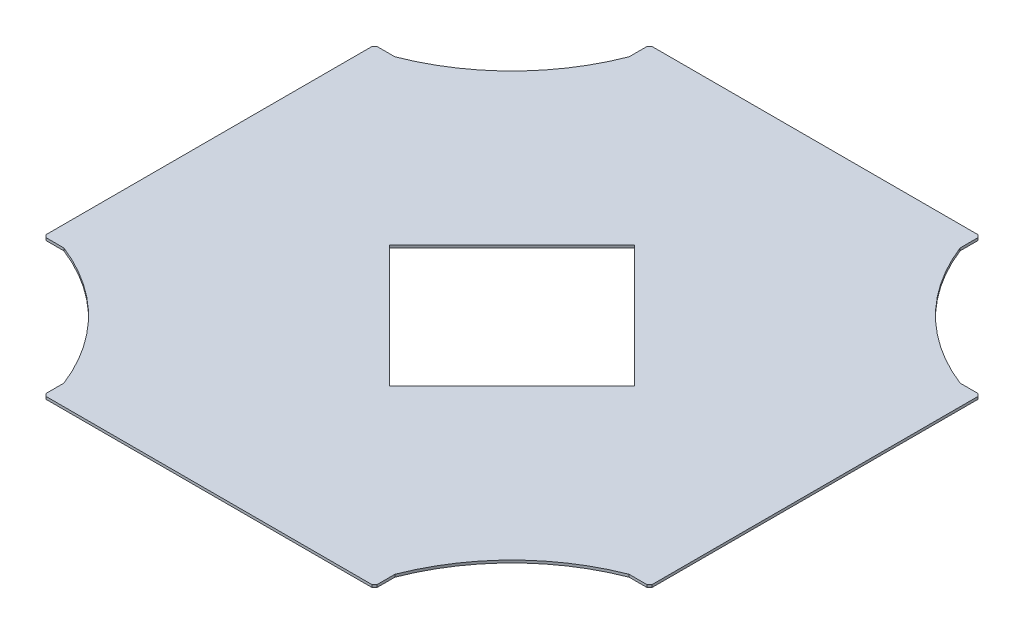
ISO-10303-21;
HEADER;
FILE_DESCRIPTION(('STEP AP214'),'2;1');
FILE_NAME('part.step','',(''),(''),'','','');
FILE_SCHEMA(('AUTOMOTIVE_DESIGN { 1 0 10303 214 1 1 1 1 }'));
ENDSEC;
DATA;
#1=APPLICATION_CONTEXT('core data for automotive mechanical design processes');
#2=APPLICATION_PROTOCOL_DEFINITION('international standard','automotive_design',2000,#1);
#3=PRODUCT_CONTEXT('',#1,'mechanical');
#4=PRODUCT('Part','Part','',(#3));
#5=PRODUCT_RELATED_PRODUCT_CATEGORY('part','',(#4));
#6=PRODUCT_DEFINITION_FORMATION('','',#4);
#7=PRODUCT_DEFINITION_CONTEXT('part definition',#1,'design');
#8=PRODUCT_DEFINITION('design','',#6,#7);
#9=PRODUCT_DEFINITION_SHAPE('','',#8);
#10=(LENGTH_UNIT() NAMED_UNIT(*) SI_UNIT(.MILLI.,.METRE.));
#11=(NAMED_UNIT(*) PLANE_ANGLE_UNIT() SI_UNIT($,.RADIAN.));
#12=(NAMED_UNIT(*) SI_UNIT($,.STERADIAN.) SOLID_ANGLE_UNIT());
#13=UNCERTAINTY_MEASURE_WITH_UNIT(LENGTH_MEASURE(1.E-05),#10,'distance_accuracy_value','');
#14=(GEOMETRIC_REPRESENTATION_CONTEXT(3) GLOBAL_UNCERTAINTY_ASSIGNED_CONTEXT((#13)) GLOBAL_UNIT_ASSIGNED_CONTEXT((#10,
#11,#12)) REPRESENTATION_CONTEXT('',''));
#15=CARTESIAN_POINT('',(0.,0.,0.));
#16=DIRECTION('',(0.,0.,1.));
#17=DIRECTION('',(1.,0.,0.));
#18=AXIS2_PLACEMENT_3D('',#15,#16,#17);
#19=CARTESIAN_POINT('',(377.825,-3.175,377.825));
#20=DIRECTION('',(1.,0.,0.));
#21=DIRECTION('',(0.,0.,-1.));
#22=AXIS2_PLACEMENT_3D('',#19,#20,#21);
#23=PLANE('',#22);
#24=DIRECTION('',(0.,0.,-1.));
#25=VECTOR('',#24,1.);
#26=CARTESIAN_POINT('',(377.825,-3.175,377.825));
#27=LINE('',#26,#25);
#28=CARTESIAN_POINT('',(377.825,-3.175,203.200000000004));
#29=VERTEX_POINT('',#28);
#30=CARTESIAN_POINT('',(377.825,-3.175,-203.2));
#31=VERTEX_POINT('',#30);
#32=EDGE_CURVE('E362',#29,#31,#27,.T.);
#33=ORIENTED_EDGE('',*,*,#32,.T.);
#34=DIRECTION('',(0.,1.,0.));
#35=VECTOR('',#34,1.);
#36=CARTESIAN_POINT('',(377.825,0.,-203.2));
#37=LINE('',#36,#35);
#38=CARTESIAN_POINT('',(377.825,0.,-203.2));
#39=VERTEX_POINT('',#38);
#40=EDGE_CURVE('E445',#31,#39,#37,.T.);
#41=ORIENTED_EDGE('',*,*,#40,.T.);
#42=DIRECTION('',(0.,0.,-1.));
#43=VECTOR('',#42,1.);
#44=CARTESIAN_POINT('',(377.825,0.,377.825));
#45=LINE('',#44,#43);
#46=CARTESIAN_POINT('',(377.825,0.,203.200000000004));
#47=VERTEX_POINT('',#46);
#48=EDGE_CURVE('E355',#47,#39,#45,.T.);
#49=ORIENTED_EDGE('',*,*,#48,.F.);
#50=DIRECTION('',(0.,-1.,0.));
#51=VECTOR('',#50,1.);
#52=CARTESIAN_POINT('',(377.825,-3.175,203.200000000004));
#53=LINE('',#52,#51);
#54=EDGE_CURVE('E441',#47,#29,#53,.T.);
#55=ORIENTED_EDGE('',*,*,#54,.T.);
#56=EDGE_LOOP('',(#33,#41,#49,#55));
#57=FACE_BOUND('',#56,.T.);
#58=ADVANCED_FACE('F49',(#57),#23,.T.);
#59=CARTESIAN_POINT('',(-377.825,-3.175,377.825));
#60=DIRECTION('',(0.,0.,1.));
#61=DIRECTION('',(1.,0.,0.));
#62=AXIS2_PLACEMENT_3D('',#59,#60,#61);
#63=PLANE('',#62);
#64=DIRECTION('',(1.,0.,0.));
#65=VECTOR('',#64,1.);
#66=CARTESIAN_POINT('',(-377.825,-3.175,377.825));
#67=LINE('',#66,#65);
#68=CARTESIAN_POINT('',(-203.199999999988,-3.175,377.825));
#69=VERTEX_POINT('',#68);
#70=CARTESIAN_POINT('',(203.200000000016,-3.175,377.825));
#71=VERTEX_POINT('',#70);
#72=EDGE_CURVE('E372',#69,#71,#67,.T.);
#73=ORIENTED_EDGE('',*,*,#72,.T.);
#74=DIRECTION('',(0.,1.,0.));
#75=VECTOR('',#74,1.);
#76=CARTESIAN_POINT('',(203.200000000016,0.,377.825));
#77=LINE('',#76,#75);
#78=CARTESIAN_POINT('',(203.200000000016,0.,377.825));
#79=VERTEX_POINT('',#78);
#80=EDGE_CURVE('E428',#71,#79,#77,.T.);
#81=ORIENTED_EDGE('',*,*,#80,.T.);
#82=DIRECTION('',(1.,0.,0.));
#83=VECTOR('',#82,1.);
#84=CARTESIAN_POINT('',(-377.825,0.,377.825));
#85=LINE('',#84,#83);
#86=CARTESIAN_POINT('',(-203.199999999988,0.,377.825));
#87=VERTEX_POINT('',#86);
#88=EDGE_CURVE('E366',#87,#79,#85,.T.);
#89=ORIENTED_EDGE('',*,*,#88,.F.);
#90=DIRECTION('',(0.,-1.,0.));
#91=VECTOR('',#90,1.);
#92=CARTESIAN_POINT('',(-203.199999999988,-3.175,377.825));
#93=LINE('',#92,#91);
#94=EDGE_CURVE('E424',#87,#69,#93,.T.);
#95=ORIENTED_EDGE('',*,*,#94,.T.);
#96=EDGE_LOOP('',(#73,#81,#89,#95));
#97=FACE_BOUND('',#96,.T.);
#98=ADVANCED_FACE('F471',(#97),#63,.T.);
#99=CARTESIAN_POINT('',(-377.825,-3.175,377.825));
#100=DIRECTION('',(-1.,0.,0.));
#101=DIRECTION('',(0.,0.,1.));
#102=AXIS2_PLACEMENT_3D('',#99,#100,#101);
#103=PLANE('',#102);
#104=DIRECTION('',(0.,0.,1.));
#105=VECTOR('',#104,1.);
#106=CARTESIAN_POINT('',(-377.825,-3.175,377.825));
#107=LINE('',#106,#105);
#108=CARTESIAN_POINT('',(-377.825,-3.175,-203.199999999984));
#109=VERTEX_POINT('',#108);
#110=CARTESIAN_POINT('',(-377.825,-3.175,203.20000000002));
#111=VERTEX_POINT('',#110);
#112=EDGE_CURVE('E369',#109,#111,#107,.T.);
#113=ORIENTED_EDGE('',*,*,#112,.T.);
#114=DIRECTION('',(0.,1.,0.));
#115=VECTOR('',#114,1.);
#116=CARTESIAN_POINT('',(-377.825,0.,203.20000000002));
#117=LINE('',#116,#115);
#118=CARTESIAN_POINT('',(-377.825,0.,203.20000000002));
#119=VERTEX_POINT('',#118);
#120=EDGE_CURVE('E410',#111,#119,#117,.T.);
#121=ORIENTED_EDGE('',*,*,#120,.T.);
#122=DIRECTION('',(0.,0.,1.));
#123=VECTOR('',#122,1.);
#124=CARTESIAN_POINT('',(-377.825,0.,377.825));
#125=LINE('',#124,#123);
#126=CARTESIAN_POINT('',(-377.825,0.,-203.199999999984));
#127=VERTEX_POINT('',#126);
#128=EDGE_CURVE('E380',#127,#119,#125,.T.);
#129=ORIENTED_EDGE('',*,*,#128,.F.);
#130=DIRECTION('',(0.,-1.,0.));
#131=VECTOR('',#130,1.);
#132=CARTESIAN_POINT('',(-377.825,-3.175,-203.199999999984));
#133=LINE('',#132,#131);
#134=EDGE_CURVE('E406',#127,#109,#133,.T.);
#135=ORIENTED_EDGE('',*,*,#134,.T.);
#136=EDGE_LOOP('',(#113,#121,#129,#135));
#137=FACE_BOUND('',#136,.T.);
#138=ADVANCED_FACE('F477',(#137),#103,.T.);
#139=CARTESIAN_POINT('',(-377.825,-3.175,-377.825));
#140=DIRECTION('',(0.,0.,-1.));
#141=DIRECTION('',(-1.,0.,0.));
#142=AXIS2_PLACEMENT_3D('',#139,#140,#141);
#143=PLANE('',#142);
#144=DIRECTION('',(-1.,0.,0.));
#145=VECTOR('',#144,1.);
#146=CARTESIAN_POINT('',(-377.825,-3.175,-377.825));
#147=LINE('',#146,#145);
#148=CARTESIAN_POINT('',(203.2,-3.175,-377.825));
#149=VERTEX_POINT('',#148);
#150=CARTESIAN_POINT('',(-203.200000000004,-3.175,-377.825));
#151=VERTEX_POINT('',#150);
#152=EDGE_CURVE('E365',#149,#151,#147,.T.);
#153=ORIENTED_EDGE('',*,*,#152,.T.);
#154=DIRECTION('',(0.,1.,0.));
#155=VECTOR('',#154,1.);
#156=CARTESIAN_POINT('',(-203.200000000004,0.,-377.825));
#157=LINE('',#156,#155);
#158=CARTESIAN_POINT('',(-203.200000000004,0.,-377.825));
#159=VERTEX_POINT('',#158);
#160=EDGE_CURVE('E392',#151,#159,#157,.T.);
#161=ORIENTED_EDGE('',*,*,#160,.T.);
#162=DIRECTION('',(-1.,0.,0.));
#163=VECTOR('',#162,1.);
#164=CARTESIAN_POINT('',(-377.825,0.,-377.825));
#165=LINE('',#164,#163);
#166=CARTESIAN_POINT('',(203.2,0.,-377.825));
#167=VERTEX_POINT('',#166);
#168=EDGE_CURVE('E377',#167,#159,#165,.T.);
#169=ORIENTED_EDGE('',*,*,#168,.F.);
#170=DIRECTION('',(0.,-1.,0.));
#171=VECTOR('',#170,1.);
#172=CARTESIAN_POINT('',(203.2,-3.175,-377.825));
#173=LINE('',#172,#171);
#174=EDGE_CURVE('E388',#167,#149,#173,.T.);
#175=ORIENTED_EDGE('',*,*,#174,.T.);
#176=EDGE_LOOP('',(#153,#161,#169,#175));
#177=FACE_BOUND('',#176,.T.);
#178=ADVANCED_FACE('F482',(#177),#143,.T.);
#179=CARTESIAN_POINT('',(0.,-3.175,0.));
#180=DIRECTION('',(0.,-1.,0.));
#181=DIRECTION('',(0.,0.,-1.));
#182=AXIS2_PLACEMENT_3D('',#179,#180,#181);
#183=PLANE('',#182);
#184=DIRECTION('',(1.,0.,0.));
#185=VECTOR('',#184,1.);
#186=CARTESIAN_POINT('',(377.825,-3.175,-206.375));
#187=LINE('',#186,#185);
#188=CARTESIAN_POINT('',(352.425,-3.175,-206.375));
#189=VERTEX_POINT('',#188);
#190=CARTESIAN_POINT('',(374.65,-3.175,-206.375));
#191=VERTEX_POINT('',#190);
#192=EDGE_CURVE('E317',#189,#191,#187,.T.);
#193=ORIENTED_EDGE('',*,*,#192,.T.);
#194=DIRECTION('',(0.707106781186548,0.,0.707106781186548));
#195=VECTOR('',#194,1.);
#196=CARTESIAN_POINT('',(290.5125,-3.175,-290.5125));
#197=LINE('',#196,#195);
#198=EDGE_CURVE('E11',#191,#31,#197,.T.);
#199=ORIENTED_EDGE('',*,*,#198,.T.);
#200=ORIENTED_EDGE('',*,*,#32,.F.);
#201=DIRECTION('',(-0.707106781186551,0.,0.707106781186544));
#202=VECTOR('',#201,1.);
#203=CARTESIAN_POINT('',(290.5125,-3.175,290.512500000003));
#204=LINE('',#203,#202);
#205=CARTESIAN_POINT('',(374.65,-3.175,206.375000000004));
#206=VERTEX_POINT('',#205);
#207=EDGE_CURVE('E443',#29,#206,#204,.T.);
#208=ORIENTED_EDGE('',*,*,#207,.T.);
#209=DIRECTION('',(-1.,0.,0.));
#210=VECTOR('',#209,1.);
#211=CARTESIAN_POINT('',(352.425000000016,-3.175,206.375000000004));
#212=LINE('',#211,#210);
#213=CARTESIAN_POINT('',(352.425000000016,-3.175,206.375000000004));
#214=VERTEX_POINT('',#213);
#215=EDGE_CURVE('E260',#206,#214,#212,.T.);
#216=ORIENTED_EDGE('',*,*,#215,.T.);
#217=CARTESIAN_POINT('',(444.763645459311,-3.175,444.763645459299));
#218=DIRECTION('',(0.,1.,0.));
#219=DIRECTION('',(0.,0.,-1.));
#220=AXIS2_PLACEMENT_3D('',#217,#218,#219);
#221=CIRCLE('',#220,255.647358150196);
#222=CARTESIAN_POINT('',(206.375000000016,-3.175,352.425000000004));
#223=VERTEX_POINT('',#222);
#224=EDGE_CURVE('E262',#214,#223,#221,.T.);
#225=ORIENTED_EDGE('',*,*,#224,.T.);
#226=DIRECTION('',(0.,0.,1.));
#227=VECTOR('',#226,1.);
#228=CARTESIAN_POINT('',(206.375000000016,-3.175,377.825000000004));
#229=LINE('',#228,#227);
#230=CARTESIAN_POINT('',(206.375000000016,-3.175,374.65));
#231=VERTEX_POINT('',#230);
#232=EDGE_CURVE('E242',#223,#231,#229,.T.);
#233=ORIENTED_EDGE('',*,*,#232,.T.);
#234=DIRECTION('',(-0.707106781186544,0.,0.707106781186551));
#235=VECTOR('',#234,1.);
#236=CARTESIAN_POINT('',(290.512500000009,-3.175,290.512500000006));
#237=LINE('',#236,#235);
#238=EDGE_CURVE('E434',#231,#71,#237,.T.);
#239=ORIENTED_EDGE('',*,*,#238,.T.);
#240=ORIENTED_EDGE('',*,*,#72,.F.);
#241=DIRECTION('',(-0.707106781186544,0.,-0.707106781186551));
#242=VECTOR('',#241,1.);
#243=CARTESIAN_POINT('',(-290.512499999995,-3.175,290.512499999992));
#244=LINE('',#243,#242);
#245=CARTESIAN_POINT('',(-206.374999999988,-3.175,374.65));
#246=VERTEX_POINT('',#245);
#247=EDGE_CURVE('E426',#69,#246,#244,.T.);
#248=ORIENTED_EDGE('',*,*,#247,.T.);
#249=DIRECTION('',(0.,0.,-1.));
#250=VECTOR('',#249,1.);
#251=CARTESIAN_POINT('',(-206.374999999988,-3.175,352.42500000002));
#252=LINE('',#251,#250);
#253=CARTESIAN_POINT('',(-206.374999999988,-3.175,352.42500000002));
#254=VERTEX_POINT('',#253);
#255=EDGE_CURVE('E281',#246,#254,#252,.T.);
#256=ORIENTED_EDGE('',*,*,#255,.T.);
#257=CARTESIAN_POINT('',(-444.763645459283,-3.175,444.763645459315));
#258=DIRECTION('',(0.,1.,0.));
#259=DIRECTION('',(0.,0.,-1.));
#260=AXIS2_PLACEMENT_3D('',#257,#258,#259);
#261=CIRCLE('',#260,255.647358150196);
#262=CARTESIAN_POINT('',(-352.424999999988,-3.175,206.37500000002));
#263=VERTEX_POINT('',#262);
#264=EDGE_CURVE('E287',#254,#263,#261,.T.);
#265=ORIENTED_EDGE('',*,*,#264,.T.);
#266=DIRECTION('',(-1.,0.,0.));
#267=VECTOR('',#266,1.);
#268=CARTESIAN_POINT('',(-377.824999999988,-3.175,206.37500000002));
#269=LINE('',#268,#267);
#270=CARTESIAN_POINT('',(-374.65,-3.175,206.37500000002));
#271=VERTEX_POINT('',#270);
#272=EDGE_CURVE('E273',#263,#271,#269,.T.);
#273=ORIENTED_EDGE('',*,*,#272,.T.);
#274=DIRECTION('',(-0.707106781186551,0.,-0.707106781186544));
#275=VECTOR('',#274,1.);
#276=CARTESIAN_POINT('',(-290.512500000008,-3.175,290.512500000011));
#277=LINE('',#276,#275);
#278=EDGE_CURVE('E417',#271,#111,#277,.T.);
#279=ORIENTED_EDGE('',*,*,#278,.T.);
#280=ORIENTED_EDGE('',*,*,#112,.F.);
#281=DIRECTION('',(0.707106781186544,0.,-0.707106781186551));
#282=VECTOR('',#281,1.);
#283=CARTESIAN_POINT('',(-290.512499999994,-3.175,-290.512499999991));
#284=LINE('',#283,#282);
#285=CARTESIAN_POINT('',(-374.65,-3.175,-206.374999999984));
#286=VERTEX_POINT('',#285);
#287=EDGE_CURVE('E408',#109,#286,#284,.T.);
#288=ORIENTED_EDGE('',*,*,#287,.T.);
#289=DIRECTION('',(1.,0.,0.));
#290=VECTOR('',#289,1.);
#291=CARTESIAN_POINT('',(-352.425000000004,-3.175,-206.374999999984));
#292=LINE('',#291,#290);
#293=CARTESIAN_POINT('',(-352.425000000004,-3.175,-206.374999999984));
#294=VERTEX_POINT('',#293);
#295=EDGE_CURVE('E301',#286,#294,#292,.T.);
#296=ORIENTED_EDGE('',*,*,#295,.T.);
#297=CARTESIAN_POINT('',(-444.763645459299,-3.175,-444.763645459279));
#298=DIRECTION('',(0.,1.,0.));
#299=DIRECTION('',(0.,0.,-1.));
#300=AXIS2_PLACEMENT_3D('',#297,#298,#299);
#301=CIRCLE('',#300,255.647358150196);
#302=CARTESIAN_POINT('',(-206.375000000004,-3.175,-352.424999999984));
#303=VERTEX_POINT('',#302);
#304=EDGE_CURVE('E307',#294,#303,#301,.T.);
#305=ORIENTED_EDGE('',*,*,#304,.T.);
#306=DIRECTION('',(0.,0.,-1.));
#307=VECTOR('',#306,1.);
#308=CARTESIAN_POINT('',(-206.375000000004,-3.175,-377.824999999984));
#309=LINE('',#308,#307);
#310=CARTESIAN_POINT('',(-206.375000000004,-3.175,-374.65));
#311=VERTEX_POINT('',#310);
#312=EDGE_CURVE('E294',#303,#311,#309,.T.);
#313=ORIENTED_EDGE('',*,*,#312,.T.);
#314=DIRECTION('',(0.707106781186544,0.,-0.707106781186551));
#315=VECTOR('',#314,1.);
#316=CARTESIAN_POINT('',(-290.512500000003,-3.175,-290.5125));
#317=LINE('',#316,#315);
#318=EDGE_CURVE('E399',#311,#151,#317,.T.);
#319=ORIENTED_EDGE('',*,*,#318,.T.);
#320=ORIENTED_EDGE('',*,*,#152,.F.);
#321=DIRECTION('',(0.707106781186541,0.,0.707106781186554));
#322=VECTOR('',#321,1.);
#323=CARTESIAN_POINT('',(290.512500000002,-3.175,-290.512499999997));
#324=LINE('',#323,#322);
#325=CARTESIAN_POINT('',(206.375,-3.175,-374.65));
#326=VERTEX_POINT('',#325);
#327=EDGE_CURVE('E390',#149,#326,#324,.T.);
#328=ORIENTED_EDGE('',*,*,#327,.T.);
#329=DIRECTION('',(0.,0.,1.));
#330=VECTOR('',#329,1.);
#331=CARTESIAN_POINT('',(206.375,-3.175,-352.425));
#332=LINE('',#331,#330);
#333=CARTESIAN_POINT('',(206.375,-3.175,-352.425));
#334=VERTEX_POINT('',#333);
#335=EDGE_CURVE('E311',#326,#334,#332,.T.);
#336=ORIENTED_EDGE('',*,*,#335,.T.);
#337=CARTESIAN_POINT('',(444.763645459295,-3.175,-444.763645459295));
#338=DIRECTION('',(0.,1.,0.));
#339=DIRECTION('',(0.,0.,-1.));
#340=AXIS2_PLACEMENT_3D('',#337,#338,#339);
#341=CIRCLE('',#340,255.647358150196);
#342=EDGE_CURVE('E313',#334,#189,#341,.T.);
#343=ORIENTED_EDGE('',*,*,#342,.T.);
#344=EDGE_LOOP('',(#193,#199,#200,#208,#216,#225,#233,#239,#240,#248,#256,#265,#273,#279,#280,
#288,#296,#305,#313,#319,#320,#328,#336,#343));
#345=FACE_BOUND('',#344,.T.);
#346=DIRECTION('',(0.707106781186548,0.,0.707106781186547));
#347=VECTOR('',#346,1.);
#348=CARTESIAN_POINT('',(0.,-3.175,152.664354058176));
#349=LINE('',#348,#347);
#350=CARTESIAN_POINT('',(-152.664354058176,-3.175,0.));
#351=VERTEX_POINT('',#350);
#352=CARTESIAN_POINT('',(0.,-3.175,152.664354058176));
#353=VERTEX_POINT('',#352);
#354=EDGE_CURVE('E330',#351,#353,#349,.T.);
#355=ORIENTED_EDGE('',*,*,#354,.T.);
#356=DIRECTION('',(0.707106781186547,0.,-0.707106781186547));
#357=VECTOR('',#356,1.);
#358=CARTESIAN_POINT('',(0.,-3.175,152.664354058176));
#359=LINE('',#358,#357);
#360=CARTESIAN_POINT('',(152.664354058176,-3.175,0.));
#361=VERTEX_POINT('',#360);
#362=EDGE_CURVE('E333',#353,#361,#359,.T.);
#363=ORIENTED_EDGE('',*,*,#362,.T.);
#364=DIRECTION('',(-0.707106781186548,0.,-0.707106781186547));
#365=VECTOR('',#364,1.);
#366=CARTESIAN_POINT('',(152.664354058176,-3.175,0.));
#367=LINE('',#366,#365);
#368=CARTESIAN_POINT('',(0.,-3.175,-152.664354058176));
#369=VERTEX_POINT('',#368);
#370=EDGE_CURVE('E337',#361,#369,#367,.T.);
#371=ORIENTED_EDGE('',*,*,#370,.T.);
#372=DIRECTION('',(-0.707106781186547,0.,0.707106781186548));
#373=VECTOR('',#372,1.);
#374=CARTESIAN_POINT('',(-152.664354058176,-3.175,0.));
#375=LINE('',#374,#373);
#376=EDGE_CURVE('E340',#369,#351,#375,.T.);
#377=ORIENTED_EDGE('',*,*,#376,.T.);
#378=EDGE_LOOP('',(#355,#363,#371,#377));
#379=FACE_BOUND('',#378,.T.);
#380=ADVANCED_FACE('F463',(#345,#379),#183,.T.);
#381=CARTESIAN_POINT('',(0.,0.,0.));
#382=DIRECTION('',(0.,-1.,0.));
#383=DIRECTION('',(0.,0.,-1.));
#384=AXIS2_PLACEMENT_3D('',#381,#382,#383);
#385=PLANE('',#384);
#386=DIRECTION('',(0.707106781186547,0.,-0.707106781186547));
#387=VECTOR('',#386,1.);
#388=CARTESIAN_POINT('',(0.,0.,152.664354058176));
#389=LINE('',#388,#387);
#390=CARTESIAN_POINT('',(0.,0.,152.664354058176));
#391=VERTEX_POINT('',#390);
#392=CARTESIAN_POINT('',(152.664354058176,0.,0.));
#393=VERTEX_POINT('',#392);
#394=EDGE_CURVE('E345',#391,#393,#389,.T.);
#395=ORIENTED_EDGE('',*,*,#394,.F.);
#396=DIRECTION('',(0.707106781186548,0.,0.707106781186547));
#397=VECTOR('',#396,1.);
#398=CARTESIAN_POINT('',(0.,0.,152.664354058176));
#399=LINE('',#398,#397);
#400=CARTESIAN_POINT('',(-152.664354058176,0.,0.));
#401=VERTEX_POINT('',#400);
#402=EDGE_CURVE('E327',#401,#391,#399,.T.);
#403=ORIENTED_EDGE('',*,*,#402,.F.);
#404=DIRECTION('',(-0.707106781186547,0.,0.707106781186548));
#405=VECTOR('',#404,1.);
#406=CARTESIAN_POINT('',(-152.664354058176,0.,0.));
#407=LINE('',#406,#405);
#408=CARTESIAN_POINT('',(0.,0.,-152.664354058176));
#409=VERTEX_POINT('',#408);
#410=EDGE_CURVE('E334',#409,#401,#407,.T.);
#411=ORIENTED_EDGE('',*,*,#410,.F.);
#412=DIRECTION('',(-0.707106781186548,0.,-0.707106781186547));
#413=VECTOR('',#412,1.);
#414=CARTESIAN_POINT('',(152.664354058176,0.,0.));
#415=LINE('',#414,#413);
#416=EDGE_CURVE('E348',#393,#409,#415,.T.);
#417=ORIENTED_EDGE('',*,*,#416,.F.);
#418=EDGE_LOOP('',(#395,#403,#411,#417));
#419=FACE_BOUND('',#418,.T.);
#420=ORIENTED_EDGE('',*,*,#48,.T.);
#421=DIRECTION('',(-0.707106781186548,0.,-0.707106781186548));
#422=VECTOR('',#421,1.);
#423=CARTESIAN_POINT('',(377.825,0.,-203.2));
#424=LINE('',#423,#422);
#425=CARTESIAN_POINT('',(374.65,0.,-206.375));
#426=VERTEX_POINT('',#425);
#427=EDGE_CURVE('E72',#39,#426,#424,.T.);
#428=ORIENTED_EDGE('',*,*,#427,.T.);
#429=DIRECTION('',(1.,0.,0.));
#430=VECTOR('',#429,1.);
#431=CARTESIAN_POINT('',(377.825,0.,-206.375));
#432=LINE('',#431,#430);
#433=CARTESIAN_POINT('',(352.425,0.,-206.375));
#434=VERTEX_POINT('',#433);
#435=EDGE_CURVE('E314',#434,#426,#432,.T.);
#436=ORIENTED_EDGE('',*,*,#435,.F.);
#437=CARTESIAN_POINT('',(444.763645459295,0.,-444.763645459295));
#438=DIRECTION('',(0.,1.,0.));
#439=DIRECTION('',(0.,0.,-1.));
#440=AXIS2_PLACEMENT_3D('',#437,#438,#439);
#441=CIRCLE('',#440,255.647358150196);
#442=CARTESIAN_POINT('',(206.375,0.,-352.425));
#443=VERTEX_POINT('',#442);
#444=EDGE_CURVE('E321',#443,#434,#441,.T.);
#445=ORIENTED_EDGE('',*,*,#444,.F.);
#446=DIRECTION('',(0.,0.,1.));
#447=VECTOR('',#446,1.);
#448=CARTESIAN_POINT('',(206.375,0.,-352.425));
#449=LINE('',#448,#447);
#450=CARTESIAN_POINT('',(206.375,0.,-374.65));
#451=VERTEX_POINT('',#450);
#452=EDGE_CURVE('E267',#451,#443,#449,.T.);
#453=ORIENTED_EDGE('',*,*,#452,.F.);
#454=DIRECTION('',(-0.707106781186541,0.,-0.707106781186554));
#455=VECTOR('',#454,1.);
#456=CARTESIAN_POINT('',(206.375,0.,-374.65));
#457=LINE('',#456,#455);
#458=EDGE_CURVE('E386',#451,#167,#457,.T.);
#459=ORIENTED_EDGE('',*,*,#458,.T.);
#460=ORIENTED_EDGE('',*,*,#168,.T.);
#461=DIRECTION('',(-0.707106781186544,0.,0.707106781186551));
#462=VECTOR('',#461,1.);
#463=CARTESIAN_POINT('',(-203.200000000004,0.,-377.825));
#464=LINE('',#463,#462);
#465=CARTESIAN_POINT('',(-206.375000000004,0.,-374.65));
#466=VERTEX_POINT('',#465);
#467=EDGE_CURVE('E395',#159,#466,#464,.T.);
#468=ORIENTED_EDGE('',*,*,#467,.T.);
#469=DIRECTION('',(0.,0.,-1.));
#470=VECTOR('',#469,1.);
#471=CARTESIAN_POINT('',(-206.375000000004,0.,-377.824999999984));
#472=LINE('',#471,#470);
#473=CARTESIAN_POINT('',(-206.375000000004,0.,-352.424999999984));
#474=VERTEX_POINT('',#473);
#475=EDGE_CURVE('E297',#474,#466,#472,.T.);
#476=ORIENTED_EDGE('',*,*,#475,.F.);
#477=CARTESIAN_POINT('',(-444.763645459299,0.,-444.763645459279));
#478=DIRECTION('',(0.,1.,0.));
#479=DIRECTION('',(0.,0.,-1.));
#480=AXIS2_PLACEMENT_3D('',#477,#478,#479);
#481=CIRCLE('',#480,255.647358150196);
#482=CARTESIAN_POINT('',(-352.425000000004,0.,-206.374999999984));
#483=VERTEX_POINT('',#482);
#484=EDGE_CURVE('E300',#483,#474,#481,.T.);
#485=ORIENTED_EDGE('',*,*,#484,.F.);
#486=DIRECTION('',(1.,0.,0.));
#487=VECTOR('',#486,1.);
#488=CARTESIAN_POINT('',(-352.425000000004,0.,-206.374999999984));
#489=LINE('',#488,#487);
#490=CARTESIAN_POINT('',(-374.65,0.,-206.374999999984));
#491=VERTEX_POINT('',#490);
#492=EDGE_CURVE('E276',#491,#483,#489,.T.);
#493=ORIENTED_EDGE('',*,*,#492,.F.);
#494=DIRECTION('',(-0.707106781186544,0.,0.707106781186551));
#495=VECTOR('',#494,1.);
#496=CARTESIAN_POINT('',(-374.65,0.,-206.374999999984));
#497=LINE('',#496,#495);
#498=EDGE_CURVE('E404',#491,#127,#497,.T.);
#499=ORIENTED_EDGE('',*,*,#498,.T.);
#500=ORIENTED_EDGE('',*,*,#128,.T.);
#501=DIRECTION('',(0.707106781186551,0.,0.707106781186544));
#502=VECTOR('',#501,1.);
#503=CARTESIAN_POINT('',(-377.825,0.,203.20000000002));
#504=LINE('',#503,#502);
#505=CARTESIAN_POINT('',(-374.65,0.,206.37500000002));
#506=VERTEX_POINT('',#505);
#507=EDGE_CURVE('E413',#119,#506,#504,.T.);
#508=ORIENTED_EDGE('',*,*,#507,.T.);
#509=DIRECTION('',(-1.,0.,0.));
#510=VECTOR('',#509,1.);
#511=CARTESIAN_POINT('',(-377.824999999988,0.,206.37500000002));
#512=LINE('',#511,#510);
#513=CARTESIAN_POINT('',(-352.424999999988,0.,206.37500000002));
#514=VERTEX_POINT('',#513);
#515=EDGE_CURVE('E277',#514,#506,#512,.T.);
#516=ORIENTED_EDGE('',*,*,#515,.F.);
#517=CARTESIAN_POINT('',(-444.763645459283,0.,444.763645459315));
#518=DIRECTION('',(0.,1.,0.));
#519=DIRECTION('',(0.,0.,-1.));
#520=AXIS2_PLACEMENT_3D('',#517,#518,#519);
#521=CIRCLE('',#520,255.647358150196);
#522=CARTESIAN_POINT('',(-206.374999999988,0.,352.42500000002));
#523=VERTEX_POINT('',#522);
#524=EDGE_CURVE('E280',#523,#514,#521,.T.);
#525=ORIENTED_EDGE('',*,*,#524,.F.);
#526=DIRECTION('',(0.,0.,-1.));
#527=VECTOR('',#526,1.);
#528=CARTESIAN_POINT('',(-206.374999999988,0.,352.42500000002));
#529=LINE('',#528,#527);
#530=CARTESIAN_POINT('',(-206.374999999988,0.,374.65));
#531=VERTEX_POINT('',#530);
#532=EDGE_CURVE('E247',#531,#523,#529,.T.);
#533=ORIENTED_EDGE('',*,*,#532,.F.);
#534=DIRECTION('',(0.707106781186544,0.,0.707106781186551));
#535=VECTOR('',#534,1.);
#536=CARTESIAN_POINT('',(-206.374999999988,0.,374.65));
#537=LINE('',#536,#535);
#538=EDGE_CURVE('E422',#531,#87,#537,.T.);
#539=ORIENTED_EDGE('',*,*,#538,.T.);
#540=ORIENTED_EDGE('',*,*,#88,.T.);
#541=DIRECTION('',(0.707106781186544,0.,-0.707106781186551));
#542=VECTOR('',#541,1.);
#543=CARTESIAN_POINT('',(203.200000000016,0.,377.825));
#544=LINE('',#543,#542);
#545=CARTESIAN_POINT('',(206.375000000016,0.,374.65));
#546=VERTEX_POINT('',#545);
#547=EDGE_CURVE('E259',#79,#546,#544,.T.);
#548=ORIENTED_EDGE('',*,*,#547,.T.);
#549=DIRECTION('',(0.,0.,1.));
#550=VECTOR('',#549,1.);
#551=CARTESIAN_POINT('',(206.375000000016,0.,377.825000000004));
#552=LINE('',#551,#550);
#553=CARTESIAN_POINT('',(206.375000000016,0.,352.425000000004));
#554=VERTEX_POINT('',#553);
#555=EDGE_CURVE('E239',#554,#546,#552,.T.);
#556=ORIENTED_EDGE('',*,*,#555,.F.);
#557=CARTESIAN_POINT('',(444.763645459311,0.,444.763645459299));
#558=DIRECTION('',(0.,1.,0.));
#559=DIRECTION('',(0.,0.,-1.));
#560=AXIS2_PLACEMENT_3D('',#557,#558,#559);
#561=CIRCLE('',#560,255.647358150196);
#562=CARTESIAN_POINT('',(352.425000000016,0.,206.375000000004));
#563=VERTEX_POINT('',#562);
#564=EDGE_CURVE('E251',#563,#554,#561,.T.);
#565=ORIENTED_EDGE('',*,*,#564,.F.);
#566=DIRECTION('',(-1.,0.,0.));
#567=VECTOR('',#566,1.);
#568=CARTESIAN_POINT('',(352.425000000016,0.,206.375000000004));
#569=LINE('',#568,#567);
#570=CARTESIAN_POINT('',(374.65,0.,206.375000000004));
#571=VERTEX_POINT('',#570);
#572=EDGE_CURVE('E255',#571,#563,#569,.T.);
#573=ORIENTED_EDGE('',*,*,#572,.F.);
#574=DIRECTION('',(0.707106781186551,0.,-0.707106781186544));
#575=VECTOR('',#574,1.);
#576=CARTESIAN_POINT('',(374.65,0.,206.375000000004));
#577=LINE('',#576,#575);
#578=EDGE_CURVE('E439',#571,#47,#577,.T.);
#579=ORIENTED_EDGE('',*,*,#578,.T.);
#580=EDGE_LOOP('',(#420,#428,#436,#445,#453,#459,#460,#468,#476,#485,#493,#499,#500,#508,#516,
#525,#533,#539,#540,#548,#556,#565,#573,#579));
#581=FACE_BOUND('',#580,.T.);
#582=ADVANCED_FACE('F257',(#419,#581),#385,.F.);
#583=CARTESIAN_POINT('',(0.,-3.175,152.664354058176));
#584=DIRECTION('',(-0.707106781186547,0.,0.707106781186548));
#585=DIRECTION('',(0.707106781186548,0.,0.707106781186547));
#586=AXIS2_PLACEMENT_3D('',#583,#584,#585);
#587=PLANE('',#586);
#588=ORIENTED_EDGE('',*,*,#402,.T.);
#589=DIRECTION('',(0.,1.,0.));
#590=VECTOR('',#589,1.);
#591=CARTESIAN_POINT('',(0.,-3.175,152.664354058176));
#592=LINE('',#591,#590);
#593=EDGE_CURVE('E343',#353,#391,#592,.T.);
#594=ORIENTED_EDGE('',*,*,#593,.F.);
#595=ORIENTED_EDGE('',*,*,#354,.F.);
#596=DIRECTION('',(0.,1.,0.));
#597=VECTOR('',#596,1.);
#598=CARTESIAN_POINT('',(-152.664354058176,-3.175,0.));
#599=LINE('',#598,#597);
#600=EDGE_CURVE('E353',#351,#401,#599,.T.);
#601=ORIENTED_EDGE('',*,*,#600,.T.);
#602=EDGE_LOOP('',(#588,#594,#595,#601));
#603=FACE_BOUND('',#602,.T.);
#604=ADVANCED_FACE('F611',(#603),#587,.F.);
#605=CARTESIAN_POINT('',(-152.664354058176,-3.175,0.));
#606=DIRECTION('',(-0.707106781186548,0.,-0.707106781186547));
#607=DIRECTION('',(-0.707106781186547,0.,0.707106781186548));
#608=AXIS2_PLACEMENT_3D('',#605,#606,#607);
#609=PLANE('',#608);
#610=ORIENTED_EDGE('',*,*,#410,.T.);
#611=ORIENTED_EDGE('',*,*,#600,.F.);
#612=ORIENTED_EDGE('',*,*,#376,.F.);
#613=DIRECTION('',(0.,1.,0.));
#614=VECTOR('',#613,1.);
#615=CARTESIAN_POINT('',(0.,-3.175,-152.664354058176));
#616=LINE('',#615,#614);
#617=EDGE_CURVE('E356',#369,#409,#616,.T.);
#618=ORIENTED_EDGE('',*,*,#617,.T.);
#619=EDGE_LOOP('',(#610,#611,#612,#618));
#620=FACE_BOUND('',#619,.T.);
#621=ADVANCED_FACE('F608',(#620),#609,.F.);
#622=CARTESIAN_POINT('',(152.664354058176,-3.175,0.));
#623=DIRECTION('',(0.707106781186547,0.,-0.707106781186548));
#624=DIRECTION('',(-0.707106781186548,0.,-0.707106781186547));
#625=AXIS2_PLACEMENT_3D('',#622,#623,#624);
#626=PLANE('',#625);
#627=ORIENTED_EDGE('',*,*,#416,.T.);
#628=ORIENTED_EDGE('',*,*,#617,.F.);
#629=ORIENTED_EDGE('',*,*,#370,.F.);
#630=DIRECTION('',(0.,1.,0.));
#631=VECTOR('',#630,1.);
#632=CARTESIAN_POINT('',(152.664354058176,-3.175,0.));
#633=LINE('',#632,#631);
#634=EDGE_CURVE('E358',#361,#393,#633,.T.);
#635=ORIENTED_EDGE('',*,*,#634,.T.);
#636=EDGE_LOOP('',(#627,#628,#629,#635));
#637=FACE_BOUND('',#636,.T.);
#638=ADVANCED_FACE('F601',(#637),#626,.F.);
#639=CARTESIAN_POINT('',(0.,-3.175,152.664354058176));
#640=DIRECTION('',(0.707106781186548,0.,0.707106781186548));
#641=DIRECTION('',(0.707106781186548,0.,-0.707106781186548));
#642=AXIS2_PLACEMENT_3D('',#639,#640,#641);
#643=PLANE('',#642);
#644=ORIENTED_EDGE('',*,*,#394,.T.);
#645=ORIENTED_EDGE('',*,*,#634,.F.);
#646=ORIENTED_EDGE('',*,*,#362,.F.);
#647=ORIENTED_EDGE('',*,*,#593,.T.);
#648=EDGE_LOOP('',(#644,#645,#646,#647));
#649=FACE_BOUND('',#648,.T.);
#650=ADVANCED_FACE('F592',(#649),#643,.F.);
#651=CARTESIAN_POINT('',(377.825,-3.175,-206.375));
#652=DIRECTION('',(0.,0.,1.));
#653=DIRECTION('',(1.,0.,0.));
#654=AXIS2_PLACEMENT_3D('',#651,#652,#653);
#655=PLANE('',#654);
#656=ORIENTED_EDGE('',*,*,#435,.T.);
#657=DIRECTION('',(0.,-1.,0.));
#658=VECTOR('',#657,1.);
#659=CARTESIAN_POINT('',(374.65,-3.175,-206.375));
#660=LINE('',#659,#658);
#661=EDGE_CURVE('E58',#426,#191,#660,.T.);
#662=ORIENTED_EDGE('',*,*,#661,.T.);
#663=ORIENTED_EDGE('',*,*,#192,.F.);
#664=DIRECTION('',(0.,1.,0.));
#665=VECTOR('',#664,1.);
#666=CARTESIAN_POINT('',(352.425,-3.175,-206.375));
#667=LINE('',#666,#665);
#668=EDGE_CURVE('E325',#189,#434,#667,.T.);
#669=ORIENTED_EDGE('',*,*,#668,.T.);
#670=EDGE_LOOP('',(#656,#662,#663,#669));
#671=FACE_BOUND('',#670,.T.);
#672=ADVANCED_FACE('F590',(#671),#655,.F.);
#673=CARTESIAN_POINT('',(444.763645459295,-3.175,-444.763645459295));
#674=DIRECTION('',(0.,1.,0.));
#675=DIRECTION('',(0.,0.,1.));
#676=AXIS2_PLACEMENT_3D('',#673,#674,#675);
#677=CYLINDRICAL_SURFACE('',#676,255.647358150196);
#678=ORIENTED_EDGE('',*,*,#444,.T.);
#679=ORIENTED_EDGE('',*,*,#668,.F.);
#680=ORIENTED_EDGE('',*,*,#342,.F.);
#681=DIRECTION('',(0.,1.,0.));
#682=VECTOR('',#681,1.);
#683=CARTESIAN_POINT('',(206.375,-3.175,-352.425));
#684=LINE('',#683,#682);
#685=EDGE_CURVE('E319',#334,#443,#684,.T.);
#686=ORIENTED_EDGE('',*,*,#685,.T.);
#687=EDGE_LOOP('',(#678,#679,#680,#686));
#688=FACE_BOUND('',#687,.T.);
#689=ADVANCED_FACE('F589',(#688),#677,.F.);
#690=CARTESIAN_POINT('',(206.375,-3.175,-352.425));
#691=DIRECTION('',(-1.,0.,0.));
#692=DIRECTION('',(0.,0.,1.));
#693=AXIS2_PLACEMENT_3D('',#690,#691,#692);
#694=PLANE('',#693);
#695=ORIENTED_EDGE('',*,*,#335,.F.);
#696=DIRECTION('',(0.,1.,0.));
#697=VECTOR('',#696,1.);
#698=CARTESIAN_POINT('',(206.375,0.,-374.65));
#699=LINE('',#698,#697);
#700=EDGE_CURVE('E375',#326,#451,#699,.T.);
#701=ORIENTED_EDGE('',*,*,#700,.T.);
#702=ORIENTED_EDGE('',*,*,#452,.T.);
#703=ORIENTED_EDGE('',*,*,#685,.F.);
#704=EDGE_LOOP('',(#695,#701,#702,#703));
#705=FACE_BOUND('',#704,.T.);
#706=ADVANCED_FACE('F584',(#705),#694,.F.);
#707=CARTESIAN_POINT('',(206.375000000016,-3.175,377.825000000004));
#708=DIRECTION('',(-1.,0.,0.));
#709=DIRECTION('',(0.,0.,1.));
#710=AXIS2_PLACEMENT_3D('',#707,#708,#709);
#711=PLANE('',#710);
#712=ORIENTED_EDGE('',*,*,#555,.T.);
#713=DIRECTION('',(0.,-1.,0.));
#714=VECTOR('',#713,1.);
#715=CARTESIAN_POINT('',(206.375000000016,-3.175,374.65));
#716=LINE('',#715,#714);
#717=EDGE_CURVE('E432',#546,#231,#716,.T.);
#718=ORIENTED_EDGE('',*,*,#717,.T.);
#719=ORIENTED_EDGE('',*,*,#232,.F.);
#720=DIRECTION('',(0.,1.,0.));
#721=VECTOR('',#720,1.);
#722=CARTESIAN_POINT('',(206.375000000016,-3.175,352.425000000004));
#723=LINE('',#722,#721);
#724=EDGE_CURVE('E235',#223,#554,#723,.T.);
#725=ORIENTED_EDGE('',*,*,#724,.T.);
#726=EDGE_LOOP('',(#712,#718,#719,#725));
#727=FACE_BOUND('',#726,.T.);
#728=ADVANCED_FACE('F237',(#727),#711,.F.);
#729=CARTESIAN_POINT('',(444.763645459311,-3.175,444.763645459299));
#730=DIRECTION('',(0.,1.,0.));
#731=DIRECTION('',(0.,0.,1.));
#732=AXIS2_PLACEMENT_3D('',#729,#730,#731);
#733=CYLINDRICAL_SURFACE('',#732,255.647358150196);
#734=ORIENTED_EDGE('',*,*,#564,.T.);
#735=ORIENTED_EDGE('',*,*,#724,.F.);
#736=ORIENTED_EDGE('',*,*,#224,.F.);
#737=DIRECTION('',(0.,1.,0.));
#738=VECTOR('',#737,1.);
#739=CARTESIAN_POINT('',(352.425000000016,-3.175,206.375000000004));
#740=LINE('',#739,#738);
#741=EDGE_CURVE('E246',#214,#563,#740,.T.);
#742=ORIENTED_EDGE('',*,*,#741,.T.);
#743=EDGE_LOOP('',(#734,#735,#736,#742));
#744=FACE_BOUND('',#743,.T.);
#745=ADVANCED_FACE('F252',(#744),#733,.F.);
#746=CARTESIAN_POINT('',(352.425000000016,-3.175,206.375000000004));
#747=DIRECTION('',(0.,0.,-1.));
#748=DIRECTION('',(-1.,0.,0.));
#749=AXIS2_PLACEMENT_3D('',#746,#747,#748);
#750=PLANE('',#749);
#751=ORIENTED_EDGE('',*,*,#215,.F.);
#752=DIRECTION('',(0.,1.,0.));
#753=VECTOR('',#752,1.);
#754=CARTESIAN_POINT('',(374.65,0.,206.375000000004));
#755=LINE('',#754,#753);
#756=EDGE_CURVE('E436',#206,#571,#755,.T.);
#757=ORIENTED_EDGE('',*,*,#756,.T.);
#758=ORIENTED_EDGE('',*,*,#572,.T.);
#759=ORIENTED_EDGE('',*,*,#741,.F.);
#760=EDGE_LOOP('',(#751,#757,#758,#759));
#761=FACE_BOUND('',#760,.T.);
#762=ADVANCED_FACE('F461',(#761),#750,.F.);
#763=CARTESIAN_POINT('',(-377.824999999988,-3.175,206.37500000002));
#764=DIRECTION('',(0.,0.,-1.));
#765=DIRECTION('',(-1.,0.,0.));
#766=AXIS2_PLACEMENT_3D('',#763,#764,#765);
#767=PLANE('',#766);
#768=ORIENTED_EDGE('',*,*,#515,.T.);
#769=DIRECTION('',(0.,-1.,0.));
#770=VECTOR('',#769,1.);
#771=CARTESIAN_POINT('',(-374.65,-3.175,206.37500000002));
#772=LINE('',#771,#770);
#773=EDGE_CURVE('E415',#506,#271,#772,.T.);
#774=ORIENTED_EDGE('',*,*,#773,.T.);
#775=ORIENTED_EDGE('',*,*,#272,.F.);
#776=DIRECTION('',(0.,1.,0.));
#777=VECTOR('',#776,1.);
#778=CARTESIAN_POINT('',(-352.424999999988,-3.175,206.37500000002));
#779=LINE('',#778,#777);
#780=EDGE_CURVE('E274',#263,#514,#779,.T.);
#781=ORIENTED_EDGE('',*,*,#780,.T.);
#782=EDGE_LOOP('',(#768,#774,#775,#781));
#783=FACE_BOUND('',#782,.T.);
#784=ADVANCED_FACE('F706',(#783),#767,.F.);
#785=CARTESIAN_POINT('',(-444.763645459283,-3.175,444.763645459315));
#786=DIRECTION('',(0.,1.,0.));
#787=DIRECTION('',(0.,0.,1.));
#788=AXIS2_PLACEMENT_3D('',#785,#786,#787);
#789=CYLINDRICAL_SURFACE('',#788,255.647358150196);
#790=ORIENTED_EDGE('',*,*,#524,.T.);
#791=ORIENTED_EDGE('',*,*,#780,.F.);
#792=ORIENTED_EDGE('',*,*,#264,.F.);
#793=DIRECTION('',(0.,1.,0.));
#794=VECTOR('',#793,1.);
#795=CARTESIAN_POINT('',(-206.374999999988,-3.175,352.42500000002));
#796=LINE('',#795,#794);
#797=EDGE_CURVE('E270',#254,#523,#796,.T.);
#798=ORIENTED_EDGE('',*,*,#797,.T.);
#799=EDGE_LOOP('',(#790,#791,#792,#798));
#800=FACE_BOUND('',#799,.T.);
#801=ADVANCED_FACE('F547',(#800),#789,.F.);
#802=CARTESIAN_POINT('',(-206.374999999988,-3.175,352.42500000002));
#803=DIRECTION('',(1.,0.,0.));
#804=DIRECTION('',(0.,0.,-1.));
#805=AXIS2_PLACEMENT_3D('',#802,#803,#804);
#806=PLANE('',#805);
#807=ORIENTED_EDGE('',*,*,#255,.F.);
#808=DIRECTION('',(0.,1.,0.));
#809=VECTOR('',#808,1.);
#810=CARTESIAN_POINT('',(-206.374999999988,0.,374.65));
#811=LINE('',#810,#809);
#812=EDGE_CURVE('E419',#246,#531,#811,.T.);
#813=ORIENTED_EDGE('',*,*,#812,.T.);
#814=ORIENTED_EDGE('',*,*,#532,.T.);
#815=ORIENTED_EDGE('',*,*,#797,.F.);
#816=EDGE_LOOP('',(#807,#813,#814,#815));
#817=FACE_BOUND('',#816,.T.);
#818=ADVANCED_FACE('F542',(#817),#806,.F.);
#819=CARTESIAN_POINT('',(-206.375000000004,-3.175,-377.824999999984));
#820=DIRECTION('',(1.,0.,0.));
#821=DIRECTION('',(0.,0.,-1.));
#822=AXIS2_PLACEMENT_3D('',#819,#820,#821);
#823=PLANE('',#822);
#824=ORIENTED_EDGE('',*,*,#475,.T.);
#825=DIRECTION('',(0.,-1.,0.));
#826=VECTOR('',#825,1.);
#827=CARTESIAN_POINT('',(-206.375000000004,-3.175,-374.65));
#828=LINE('',#827,#826);
#829=EDGE_CURVE('E397',#466,#311,#828,.T.);
#830=ORIENTED_EDGE('',*,*,#829,.T.);
#831=ORIENTED_EDGE('',*,*,#312,.F.);
#832=DIRECTION('',(0.,1.,0.));
#833=VECTOR('',#832,1.);
#834=CARTESIAN_POINT('',(-206.375000000004,-3.175,-352.424999999984));
#835=LINE('',#834,#833);
#836=EDGE_CURVE('E295',#303,#474,#835,.T.);
#837=ORIENTED_EDGE('',*,*,#836,.T.);
#838=EDGE_LOOP('',(#824,#830,#831,#837));
#839=FACE_BOUND('',#838,.T.);
#840=ADVANCED_FACE('F572',(#839),#823,.F.);
#841=CARTESIAN_POINT('',(-444.763645459299,-3.175,-444.763645459279));
#842=DIRECTION('',(0.,1.,0.));
#843=DIRECTION('',(0.,0.,1.));
#844=AXIS2_PLACEMENT_3D('',#841,#842,#843);
#845=CYLINDRICAL_SURFACE('',#844,255.647358150196);
#846=ORIENTED_EDGE('',*,*,#484,.T.);
#847=ORIENTED_EDGE('',*,*,#836,.F.);
#848=ORIENTED_EDGE('',*,*,#304,.F.);
#849=DIRECTION('',(0.,1.,0.));
#850=VECTOR('',#849,1.);
#851=CARTESIAN_POINT('',(-352.425000000004,-3.175,-206.374999999984));
#852=LINE('',#851,#850);
#853=EDGE_CURVE('E291',#294,#483,#852,.T.);
#854=ORIENTED_EDGE('',*,*,#853,.T.);
#855=EDGE_LOOP('',(#846,#847,#848,#854));
#856=FACE_BOUND('',#855,.T.);
#857=ADVANCED_FACE('F569',(#856),#845,.F.);
#858=CARTESIAN_POINT('',(-352.425000000004,-3.175,-206.374999999984));
#859=DIRECTION('',(0.,0.,1.));
#860=DIRECTION('',(1.,0.,0.));
#861=AXIS2_PLACEMENT_3D('',#858,#859,#860);
#862=PLANE('',#861);
#863=ORIENTED_EDGE('',*,*,#295,.F.);
#864=DIRECTION('',(0.,1.,0.));
#865=VECTOR('',#864,1.);
#866=CARTESIAN_POINT('',(-374.65,0.,-206.374999999984));
#867=LINE('',#866,#865);
#868=EDGE_CURVE('E401',#286,#491,#867,.T.);
#869=ORIENTED_EDGE('',*,*,#868,.T.);
#870=ORIENTED_EDGE('',*,*,#492,.T.);
#871=ORIENTED_EDGE('',*,*,#853,.F.);
#872=EDGE_LOOP('',(#863,#869,#870,#871));
#873=FACE_BOUND('',#872,.T.);
#874=ADVANCED_FACE('F492',(#873),#862,.F.);
#875=CARTESIAN_POINT('',(206.375,-3.175,-374.65));
#876=DIRECTION('',(0.707106781186554,0.,-0.707106781186541));
#877=DIRECTION('',(0.,-1.,0.));
#878=AXIS2_PLACEMENT_3D('',#875,#876,#877);
#879=PLANE('',#878);
#880=ORIENTED_EDGE('',*,*,#327,.F.);
#881=ORIENTED_EDGE('',*,*,#174,.F.);
#882=ORIENTED_EDGE('',*,*,#458,.F.);
#883=ORIENTED_EDGE('',*,*,#700,.F.);
#884=EDGE_LOOP('',(#880,#881,#882,#883));
#885=FACE_BOUND('',#884,.T.);
#886=ADVANCED_FACE('F485',(#885),#879,.T.);
#887=CARTESIAN_POINT('',(-203.200000000004,-3.175,-377.825));
#888=DIRECTION('',(-0.707106781186551,0.,-0.707106781186544));
#889=DIRECTION('',(0.,-1.,0.));
#890=AXIS2_PLACEMENT_3D('',#887,#888,#889);
#891=PLANE('',#890);
#892=ORIENTED_EDGE('',*,*,#318,.F.);
#893=ORIENTED_EDGE('',*,*,#829,.F.);
#894=ORIENTED_EDGE('',*,*,#467,.F.);
#895=ORIENTED_EDGE('',*,*,#160,.F.);
#896=EDGE_LOOP('',(#892,#893,#894,#895));
#897=FACE_BOUND('',#896,.T.);
#898=ADVANCED_FACE('F491',(#897),#891,.T.);
#899=CARTESIAN_POINT('',(-374.65,-3.175,-206.374999999984));
#900=DIRECTION('',(-0.707106781186551,0.,-0.707106781186544));
#901=DIRECTION('',(0.,-1.,0.));
#902=AXIS2_PLACEMENT_3D('',#899,#900,#901);
#903=PLANE('',#902);
#904=ORIENTED_EDGE('',*,*,#287,.F.);
#905=ORIENTED_EDGE('',*,*,#134,.F.);
#906=ORIENTED_EDGE('',*,*,#498,.F.);
#907=ORIENTED_EDGE('',*,*,#868,.F.);
#908=EDGE_LOOP('',(#904,#905,#906,#907));
#909=FACE_BOUND('',#908,.T.);
#910=ADVANCED_FACE('F499',(#909),#903,.T.);
#911=CARTESIAN_POINT('',(-377.825,-3.175,203.20000000002));
#912=DIRECTION('',(-0.707106781186544,0.,0.707106781186551));
#913=DIRECTION('',(0.,-1.,0.));
#914=AXIS2_PLACEMENT_3D('',#911,#912,#913);
#915=PLANE('',#914);
#916=ORIENTED_EDGE('',*,*,#278,.F.);
#917=ORIENTED_EDGE('',*,*,#773,.F.);
#918=ORIENTED_EDGE('',*,*,#507,.F.);
#919=ORIENTED_EDGE('',*,*,#120,.F.);
#920=EDGE_LOOP('',(#916,#917,#918,#919));
#921=FACE_BOUND('',#920,.T.);
#922=ADVANCED_FACE('F506',(#921),#915,.T.);
#923=CARTESIAN_POINT('',(-206.374999999988,-3.175,374.65));
#924=DIRECTION('',(-0.707106781186551,0.,0.707106781186544));
#925=DIRECTION('',(0.,-1.,0.));
#926=AXIS2_PLACEMENT_3D('',#923,#924,#925);
#927=PLANE('',#926);
#928=ORIENTED_EDGE('',*,*,#247,.F.);
#929=ORIENTED_EDGE('',*,*,#94,.F.);
#930=ORIENTED_EDGE('',*,*,#538,.F.);
#931=ORIENTED_EDGE('',*,*,#812,.F.);
#932=EDGE_LOOP('',(#928,#929,#930,#931));
#933=FACE_BOUND('',#932,.T.);
#934=ADVANCED_FACE('F513',(#933),#927,.T.);
#935=CARTESIAN_POINT('',(203.200000000016,-3.175,377.825));
#936=DIRECTION('',(0.707106781186551,0.,0.707106781186544));
#937=DIRECTION('',(0.,-1.,0.));
#938=AXIS2_PLACEMENT_3D('',#935,#936,#937);
#939=PLANE('',#938);
#940=ORIENTED_EDGE('',*,*,#238,.F.);
#941=ORIENTED_EDGE('',*,*,#717,.F.);
#942=ORIENTED_EDGE('',*,*,#547,.F.);
#943=ORIENTED_EDGE('',*,*,#80,.F.);
#944=EDGE_LOOP('',(#940,#941,#942,#943));
#945=FACE_BOUND('',#944,.T.);
#946=ADVANCED_FACE('F469',(#945),#939,.T.);
#947=CARTESIAN_POINT('',(374.65,-3.175,206.375000000004));
#948=DIRECTION('',(0.707106781186544,0.,0.707106781186551));
#949=DIRECTION('',(0.,-1.,0.));
#950=AXIS2_PLACEMENT_3D('',#947,#948,#949);
#951=PLANE('',#950);
#952=ORIENTED_EDGE('',*,*,#207,.F.);
#953=ORIENTED_EDGE('',*,*,#54,.F.);
#954=ORIENTED_EDGE('',*,*,#578,.F.);
#955=ORIENTED_EDGE('',*,*,#756,.F.);
#956=EDGE_LOOP('',(#952,#953,#954,#955));
#957=FACE_BOUND('',#956,.T.);
#958=ADVANCED_FACE('F458',(#957),#951,.T.);
#959=CARTESIAN_POINT('',(377.825,-3.175,-203.2));
#960=DIRECTION('',(0.707106781186548,0.,-0.707106781186548));
#961=DIRECTION('',(0.,-1.,0.));
#962=AXIS2_PLACEMENT_3D('',#959,#960,#961);
#963=PLANE('',#962);
#964=ORIENTED_EDGE('',*,*,#198,.F.);
#965=ORIENTED_EDGE('',*,*,#661,.F.);
#966=ORIENTED_EDGE('',*,*,#427,.F.);
#967=ORIENTED_EDGE('',*,*,#40,.F.);
#968=EDGE_LOOP('',(#964,#965,#966,#967));
#969=FACE_BOUND('',#968,.T.);
#970=ADVANCED_FACE('F52',(#969),#963,.T.);
#971=CLOSED_SHELL('',(#58,#98,#138,#178,#380,#582,#604,#621,#638,#650,#672,#689,#706,#728,#745,
#762,#784,#801,#818,#840,#857,#874,#886,#898,#910,#922,#934,#946,#958,#970));
#972=MANIFOLD_SOLID_BREP('B2',#971);
#973=ADVANCED_BREP_SHAPE_REPRESENTATION('',(#18,#972),#14);
#974=SHAPE_DEFINITION_REPRESENTATION(#9,#973);
ENDSEC;
END-ISO-10303-21;
